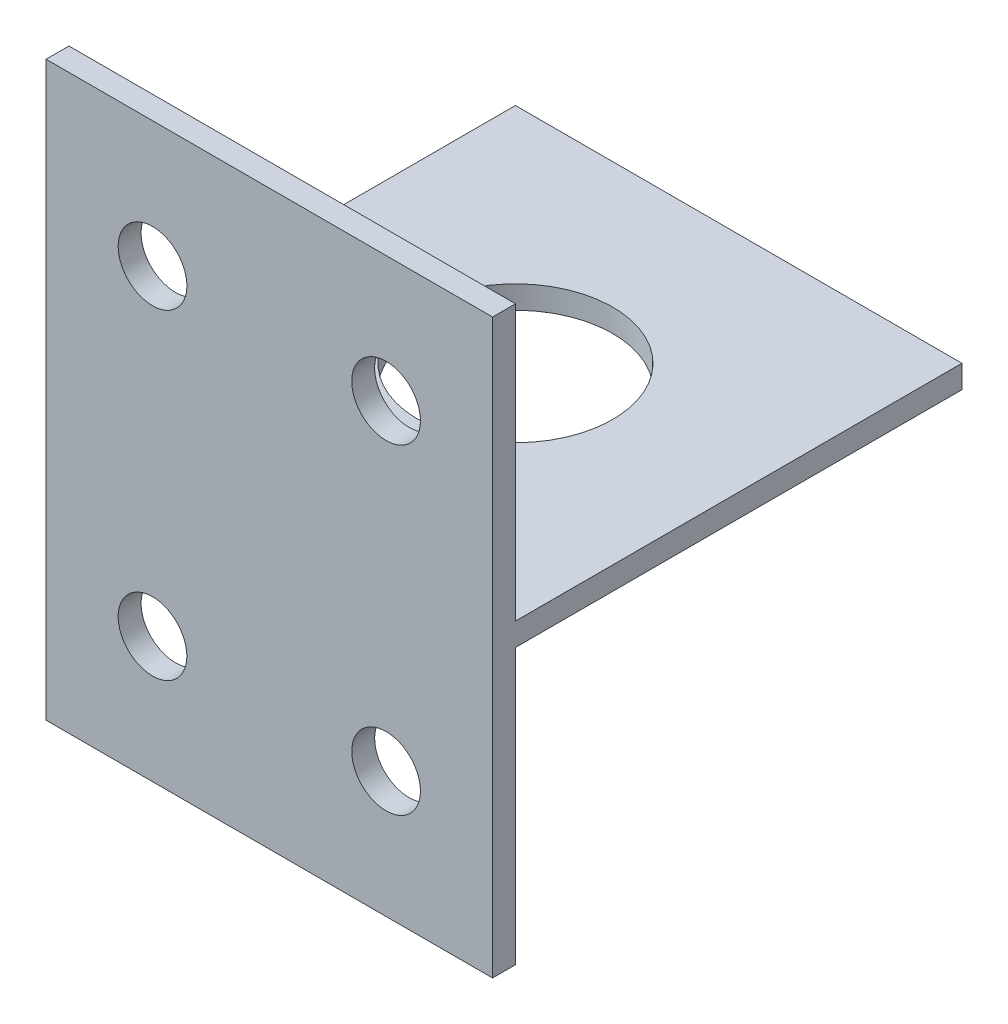
ISO-10303-21;
HEADER;
FILE_DESCRIPTION(('STEP AP214'),'2;1');
FILE_NAME('part.step','',(''),(''),'','','');
FILE_SCHEMA(('AUTOMOTIVE_DESIGN { 1 0 10303 214 1 1 1 1 }'));
ENDSEC;
DATA;
#1=APPLICATION_CONTEXT('core data for automotive mechanical design processes');
#2=APPLICATION_PROTOCOL_DEFINITION('international standard','automotive_design',2000,#1);
#3=PRODUCT_CONTEXT('',#1,'mechanical');
#4=PRODUCT('Part','Part','',(#3));
#5=PRODUCT_RELATED_PRODUCT_CATEGORY('part','',(#4));
#6=PRODUCT_DEFINITION_FORMATION('','',#4);
#7=PRODUCT_DEFINITION_CONTEXT('part definition',#1,'design');
#8=PRODUCT_DEFINITION('design','',#6,#7);
#9=PRODUCT_DEFINITION_SHAPE('','',#8);
#10=(LENGTH_UNIT() NAMED_UNIT(*) SI_UNIT(.MILLI.,.METRE.));
#11=(NAMED_UNIT(*) PLANE_ANGLE_UNIT() SI_UNIT($,.RADIAN.));
#12=(NAMED_UNIT(*) SI_UNIT($,.STERADIAN.) SOLID_ANGLE_UNIT());
#13=UNCERTAINTY_MEASURE_WITH_UNIT(LENGTH_MEASURE(1.E-05),#10,'distance_accuracy_value','');
#14=(GEOMETRIC_REPRESENTATION_CONTEXT(3) GLOBAL_UNCERTAINTY_ASSIGNED_CONTEXT((#13)) GLOBAL_UNIT_ASSIGNED_CONTEXT((#10,
#11,#12)) REPRESENTATION_CONTEXT('',''));
#15=CARTESIAN_POINT('',(0.,0.,0.));
#16=DIRECTION('',(0.,0.,1.));
#17=DIRECTION('',(1.,0.,0.));
#18=AXIS2_PLACEMENT_3D('',#15,#16,#17);
#19=CARTESIAN_POINT('',(0.,0.,0.));
#20=DIRECTION('',(0.,0.,1.));
#21=DIRECTION('',(1.,0.,0.));
#22=AXIS2_PLACEMENT_3D('',#19,#20,#21);
#23=PLANE('',#22);
#24=CARTESIAN_POINT('',(5.10059027183304,7.00228745871975,0.));
#25=DIRECTION('',(0.,0.,-1.));
#26=DIRECTION('',(1.,0.,0.));
#27=AXIS2_PLACEMENT_3D('',#24,#25,#26);
#28=CIRCLE('',#27,1.5);
#29=CARTESIAN_POINT('',(6.60059027183304,7.00228745871975,0.));
#30=VERTEX_POINT('',#29);
#31=EDGE_CURVE('E403',#30,#30,#28,.T.);
#32=ORIENTED_EDGE('',*,*,#31,.F.);
#33=EDGE_LOOP('',(#32));
#34=FACE_BOUND('',#33,.T.);
#35=CARTESIAN_POINT('',(-5.10059027183304,7.00228745871976,0.));
#36=DIRECTION('',(0.,0.,-1.));
#37=DIRECTION('',(-1.,0.,0.));
#38=AXIS2_PLACEMENT_3D('',#35,#36,#37);
#39=CIRCLE('',#38,1.5);
#40=CARTESIAN_POINT('',(-6.60059027183304,7.00228745871976,0.));
#41=VERTEX_POINT('',#40);
#42=EDGE_CURVE('E407',#41,#41,#39,.T.);
#43=ORIENTED_EDGE('',*,*,#42,.F.);
#44=EDGE_LOOP('',(#43));
#45=FACE_BOUND('',#44,.T.);
#46=DIRECTION('',(1.,0.,0.));
#47=VECTOR('',#46,1.);
#48=CARTESIAN_POINT('',(-9.75,0.500000000000001,0.));
#49=LINE('',#48,#47);
#50=CARTESIAN_POINT('',(-9.75,0.499999999999997,0.));
#51=VERTEX_POINT('',#50);
#52=CARTESIAN_POINT('',(9.75,0.499999999999997,0.));
#53=VERTEX_POINT('',#52);
#54=EDGE_CURVE('E131',#51,#53,#49,.T.);
#55=ORIENTED_EDGE('',*,*,#54,.F.);
#56=DIRECTION('',(0.,-1.,0.));
#57=VECTOR('',#56,1.);
#58=CARTESIAN_POINT('',(-9.75,-12.5,0.));
#59=LINE('',#58,#57);
#60=CARTESIAN_POINT('',(-9.75,12.5,0.));
#61=VERTEX_POINT('',#60);
#62=EDGE_CURVE('E141',#61,#51,#59,.T.);
#63=ORIENTED_EDGE('',*,*,#62,.F.);
#64=DIRECTION('',(-1.,0.,0.));
#65=VECTOR('',#64,1.);
#66=CARTESIAN_POINT('',(9.75,12.5,0.));
#67=LINE('',#66,#65);
#68=CARTESIAN_POINT('',(9.75,12.5,0.));
#69=VERTEX_POINT('',#68);
#70=EDGE_CURVE('E152',#69,#61,#67,.T.);
#71=ORIENTED_EDGE('',*,*,#70,.F.);
#72=DIRECTION('',(0.,1.,0.));
#73=VECTOR('',#72,1.);
#74=CARTESIAN_POINT('',(9.75,-12.5,0.));
#75=LINE('',#74,#73);
#76=EDGE_CURVE('E59',#53,#69,#75,.T.);
#77=ORIENTED_EDGE('',*,*,#76,.F.);
#78=EDGE_LOOP('',(#55,#63,#71,#77));
#79=FACE_BOUND('',#78,.T.);
#80=ADVANCED_FACE('F43',(#34,#45,#79),#23,.F.);
#81=CARTESIAN_POINT('',(-5.10059027183304,-7.00228745871976,0.));
#82=DIRECTION('',(0.,0.,-1.));
#83=DIRECTION('',(1.,0.,0.));
#84=AXIS2_PLACEMENT_3D('',#81,#82,#83);
#85=CIRCLE('',#84,1.5);
#86=CARTESIAN_POINT('',(-3.60059027183304,-7.00228745871976,0.));
#87=VERTEX_POINT('',#86);
#88=EDGE_CURVE('E412',#87,#87,#85,.T.);
#89=ORIENTED_EDGE('',*,*,#88,.F.);
#90=EDGE_LOOP('',(#89));
#91=FACE_BOUND('',#90,.T.);
#92=CARTESIAN_POINT('',(5.10059027183304,-7.00228745871975,0.));
#93=DIRECTION('',(0.,0.,-1.));
#94=DIRECTION('',(-1.,0.,0.));
#95=AXIS2_PLACEMENT_3D('',#92,#93,#94);
#96=CIRCLE('',#95,1.5);
#97=CARTESIAN_POINT('',(3.60059027183304,-7.00228745871975,0.));
#98=VERTEX_POINT('',#97);
#99=EDGE_CURVE('E395',#98,#98,#96,.T.);
#100=ORIENTED_EDGE('',*,*,#99,.F.);
#101=EDGE_LOOP('',(#100));
#102=FACE_BOUND('',#101,.T.);
#103=DIRECTION('',(-1.,0.,0.));
#104=VECTOR('',#103,1.);
#105=CARTESIAN_POINT('',(-9.75,-0.499999999999999,0.));
#106=LINE('',#105,#104);
#107=CARTESIAN_POINT('',(9.75,-0.500000000000004,0.));
#108=VERTEX_POINT('',#107);
#109=CARTESIAN_POINT('',(-9.75,-0.499999999999999,0.));
#110=VERTEX_POINT('',#109);
#111=EDGE_CURVE('E67',#108,#110,#106,.T.);
#112=ORIENTED_EDGE('',*,*,#111,.F.);
#113=CARTESIAN_POINT('',(9.75,-12.5,0.));
#114=VERTEX_POINT('',#113);
#115=EDGE_CURVE('E135',#114,#108,#75,.T.);
#116=ORIENTED_EDGE('',*,*,#115,.F.);
#117=DIRECTION('',(1.,0.,0.));
#118=VECTOR('',#117,1.);
#119=CARTESIAN_POINT('',(9.75,-12.5,0.));
#120=LINE('',#119,#118);
#121=CARTESIAN_POINT('',(-9.75,-12.5,0.));
#122=VERTEX_POINT('',#121);
#123=EDGE_CURVE('E164',#122,#114,#120,.T.);
#124=ORIENTED_EDGE('',*,*,#123,.F.);
#125=EDGE_CURVE('E137',#110,#122,#59,.T.);
#126=ORIENTED_EDGE('',*,*,#125,.F.);
#127=EDGE_LOOP('',(#112,#116,#124,#126));
#128=FACE_BOUND('',#127,.T.);
#129=ADVANCED_FACE('F183',(#91,#102,#128),#23,.F.);
#130=CARTESIAN_POINT('',(-9.75,-12.5,1.));
#131=DIRECTION('',(1.,0.,0.));
#132=DIRECTION('',(0.,0.,-1.));
#133=AXIS2_PLACEMENT_3D('',#130,#131,#132);
#134=PLANE('',#133);
#135=ORIENTED_EDGE('',*,*,#62,.T.);
#136=DIRECTION('',(0.,0.,1.));
#137=VECTOR('',#136,1.);
#138=CARTESIAN_POINT('',(-9.75,0.500000000000001,-19.5));
#139=LINE('',#138,#137);
#140=CARTESIAN_POINT('',(-9.75,0.500000000000001,-19.5));
#141=VERTEX_POINT('',#140);
#142=EDGE_CURVE('E143',#141,#51,#139,.T.);
#143=ORIENTED_EDGE('',*,*,#142,.F.);
#144=DIRECTION('',(0.,1.,0.));
#145=VECTOR('',#144,1.);
#146=CARTESIAN_POINT('',(-9.75,-0.499999999999999,-19.5));
#147=LINE('',#146,#145);
#148=CARTESIAN_POINT('',(-9.75,-0.499999999999999,-19.5));
#149=VERTEX_POINT('',#148);
#150=EDGE_CURVE('E120',#149,#141,#147,.T.);
#151=ORIENTED_EDGE('',*,*,#150,.F.);
#152=DIRECTION('',(0.,0.,1.));
#153=VECTOR('',#152,1.);
#154=CARTESIAN_POINT('',(-9.75,-0.499999999999999,-19.5));
#155=LINE('',#154,#153);
#156=EDGE_CURVE('E116',#149,#110,#155,.T.);
#157=ORIENTED_EDGE('',*,*,#156,.T.);
#158=ORIENTED_EDGE('',*,*,#125,.T.);
#159=DIRECTION('',(0.,0.,-1.));
#160=VECTOR('',#159,1.);
#161=CARTESIAN_POINT('',(-9.75,-12.5,1.));
#162=LINE('',#161,#160);
#163=CARTESIAN_POINT('',(-9.75,-12.5,1.));
#164=VERTEX_POINT('',#163);
#165=EDGE_CURVE('E11',#164,#122,#162,.T.);
#166=ORIENTED_EDGE('',*,*,#165,.F.);
#167=DIRECTION('',(0.,-1.,0.));
#168=VECTOR('',#167,1.);
#169=CARTESIAN_POINT('',(-9.75,-12.5,1.));
#170=LINE('',#169,#168);
#171=CARTESIAN_POINT('',(-9.75,12.5,1.));
#172=VERTEX_POINT('',#171);
#173=EDGE_CURVE('E147',#172,#164,#170,.T.);
#174=ORIENTED_EDGE('',*,*,#173,.F.);
#175=DIRECTION('',(0.,0.,-1.));
#176=VECTOR('',#175,1.);
#177=CARTESIAN_POINT('',(-9.75,12.5,1.));
#178=LINE('',#177,#176);
#179=EDGE_CURVE('E160',#172,#61,#178,.T.);
#180=ORIENTED_EDGE('',*,*,#179,.T.);
#181=EDGE_LOOP('',(#135,#143,#151,#157,#158,#166,#174,#180));
#182=FACE_BOUND('',#181,.T.);
#183=ADVANCED_FACE('F45',(#182),#134,.F.);
#184=CARTESIAN_POINT('',(9.75,-12.5,1.));
#185=DIRECTION('',(0.,1.,0.));
#186=DIRECTION('',(-1.,0.,0.));
#187=AXIS2_PLACEMENT_3D('',#184,#185,#186);
#188=PLANE('',#187);
#189=ORIENTED_EDGE('',*,*,#123,.T.);
#190=DIRECTION('',(0.,0.,-1.));
#191=VECTOR('',#190,1.);
#192=CARTESIAN_POINT('',(9.75,-12.5,1.));
#193=LINE('',#192,#191);
#194=CARTESIAN_POINT('',(9.75,-12.5,1.));
#195=VERTEX_POINT('',#194);
#196=EDGE_CURVE('E52',#195,#114,#193,.T.);
#197=ORIENTED_EDGE('',*,*,#196,.F.);
#198=DIRECTION('',(1.,0.,0.));
#199=VECTOR('',#198,1.);
#200=CARTESIAN_POINT('',(9.75,-12.5,1.));
#201=LINE('',#200,#199);
#202=EDGE_CURVE('E151',#164,#195,#201,.T.);
#203=ORIENTED_EDGE('',*,*,#202,.F.);
#204=ORIENTED_EDGE('',*,*,#165,.T.);
#205=EDGE_LOOP('',(#189,#197,#203,#204));
#206=FACE_BOUND('',#205,.T.);
#207=ADVANCED_FACE('F185',(#206),#188,.F.);
#208=CARTESIAN_POINT('',(9.75,-12.5,1.));
#209=DIRECTION('',(-1.,0.,0.));
#210=DIRECTION('',(0.,0.,1.));
#211=AXIS2_PLACEMENT_3D('',#208,#209,#210);
#212=PLANE('',#211);
#213=ORIENTED_EDGE('',*,*,#115,.T.);
#214=DIRECTION('',(0.,0.,1.));
#215=VECTOR('',#214,1.);
#216=CARTESIAN_POINT('',(9.75,-0.500000000000001,-19.5));
#217=LINE('',#216,#215);
#218=CARTESIAN_POINT('',(9.75,-0.500000000000001,-19.5));
#219=VERTEX_POINT('',#218);
#220=EDGE_CURVE('E114',#219,#108,#217,.T.);
#221=ORIENTED_EDGE('',*,*,#220,.F.);
#222=DIRECTION('',(0.,-1.,0.));
#223=VECTOR('',#222,1.);
#224=CARTESIAN_POINT('',(9.75,-0.500000000000001,-19.5));
#225=LINE('',#224,#223);
#226=CARTESIAN_POINT('',(9.75,0.499999999999999,-19.5));
#227=VERTEX_POINT('',#226);
#228=EDGE_CURVE('E121',#227,#219,#225,.T.);
#229=ORIENTED_EDGE('',*,*,#228,.F.);
#230=DIRECTION('',(0.,0.,1.));
#231=VECTOR('',#230,1.);
#232=CARTESIAN_POINT('',(9.75,0.499999999999999,-19.5));
#233=LINE('',#232,#231);
#234=EDGE_CURVE('E193',#227,#53,#233,.T.);
#235=ORIENTED_EDGE('',*,*,#234,.T.);
#236=ORIENTED_EDGE('',*,*,#76,.T.);
#237=DIRECTION('',(0.,0.,-1.));
#238=VECTOR('',#237,1.);
#239=CARTESIAN_POINT('',(9.75,12.5,1.));
#240=LINE('',#239,#238);
#241=CARTESIAN_POINT('',(9.75,12.5,1.));
#242=VERTEX_POINT('',#241);
#243=EDGE_CURVE('E174',#242,#69,#240,.T.);
#244=ORIENTED_EDGE('',*,*,#243,.F.);
#245=DIRECTION('',(0.,1.,0.));
#246=VECTOR('',#245,1.);
#247=CARTESIAN_POINT('',(9.75,-12.5,1.));
#248=LINE('',#247,#246);
#249=EDGE_CURVE('E155',#195,#242,#248,.T.);
#250=ORIENTED_EDGE('',*,*,#249,.F.);
#251=ORIENTED_EDGE('',*,*,#196,.T.);
#252=EDGE_LOOP('',(#213,#221,#229,#235,#236,#244,#250,#251));
#253=FACE_BOUND('',#252,.T.);
#254=ADVANCED_FACE('F133',(#253),#212,.F.);
#255=CARTESIAN_POINT('',(9.75,12.5,1.));
#256=DIRECTION('',(0.,-1.,0.));
#257=DIRECTION('',(1.,0.,0.));
#258=AXIS2_PLACEMENT_3D('',#255,#256,#257);
#259=PLANE('',#258);
#260=ORIENTED_EDGE('',*,*,#70,.T.);
#261=ORIENTED_EDGE('',*,*,#179,.F.);
#262=DIRECTION('',(-1.,0.,0.));
#263=VECTOR('',#262,1.);
#264=CARTESIAN_POINT('',(9.75,12.5,1.));
#265=LINE('',#264,#263);
#266=EDGE_CURVE('E158',#242,#172,#265,.T.);
#267=ORIENTED_EDGE('',*,*,#266,.F.);
#268=ORIENTED_EDGE('',*,*,#243,.T.);
#269=EDGE_LOOP('',(#260,#261,#267,#268));
#270=FACE_BOUND('',#269,.T.);
#271=ADVANCED_FACE('F208',(#270),#259,.F.);
#272=CARTESIAN_POINT('',(0.,0.,1.));
#273=DIRECTION('',(0.,0.,1.));
#274=DIRECTION('',(1.,0.,0.));
#275=AXIS2_PLACEMENT_3D('',#272,#273,#274);
#276=PLANE('',#275);
#277=CARTESIAN_POINT('',(5.10059027183304,7.00228745871975,1.));
#278=DIRECTION('',(0.,0.,-1.));
#279=DIRECTION('',(1.,0.,0.));
#280=AXIS2_PLACEMENT_3D('',#277,#278,#279);
#281=CIRCLE('',#280,1.5);
#282=CARTESIAN_POINT('',(6.60059027183304,7.00228745871975,1.));
#283=VERTEX_POINT('',#282);
#284=EDGE_CURVE('E408',#283,#283,#281,.T.);
#285=ORIENTED_EDGE('',*,*,#284,.T.);
#286=EDGE_LOOP('',(#285));
#287=FACE_BOUND('',#286,.T.);
#288=CARTESIAN_POINT('',(-5.10059027183304,-7.00228745871976,1.));
#289=DIRECTION('',(0.,0.,-1.));
#290=DIRECTION('',(1.,0.,0.));
#291=AXIS2_PLACEMENT_3D('',#288,#289,#290);
#292=CIRCLE('',#291,1.5);
#293=CARTESIAN_POINT('',(-3.60059027183304,-7.00228745871976,1.));
#294=VERTEX_POINT('',#293);
#295=EDGE_CURVE('E401',#294,#294,#292,.T.);
#296=ORIENTED_EDGE('',*,*,#295,.T.);
#297=EDGE_LOOP('',(#296));
#298=FACE_BOUND('',#297,.T.);
#299=CARTESIAN_POINT('',(5.10059027183304,-7.00228745871975,1.));
#300=DIRECTION('',(0.,0.,-1.));
#301=DIRECTION('',(-1.,0.,0.));
#302=AXIS2_PLACEMENT_3D('',#299,#300,#301);
#303=CIRCLE('',#302,1.5);
#304=CARTESIAN_POINT('',(3.60059027183304,-7.00228745871975,1.));
#305=VERTEX_POINT('',#304);
#306=EDGE_CURVE('E390',#305,#305,#303,.T.);
#307=ORIENTED_EDGE('',*,*,#306,.T.);
#308=EDGE_LOOP('',(#307));
#309=FACE_BOUND('',#308,.T.);
#310=CARTESIAN_POINT('',(-5.10059027183304,7.00228745871976,1.));
#311=DIRECTION('',(0.,0.,-1.));
#312=DIRECTION('',(-1.,0.,0.));
#313=AXIS2_PLACEMENT_3D('',#310,#311,#312);
#314=CIRCLE('',#313,1.5);
#315=CARTESIAN_POINT('',(-6.60059027183304,7.00228745871976,1.));
#316=VERTEX_POINT('',#315);
#317=EDGE_CURVE('E198',#316,#316,#314,.T.);
#318=ORIENTED_EDGE('',*,*,#317,.T.);
#319=EDGE_LOOP('',(#318));
#320=FACE_BOUND('',#319,.T.);
#321=ORIENTED_EDGE('',*,*,#173,.T.);
#322=ORIENTED_EDGE('',*,*,#202,.T.);
#323=ORIENTED_EDGE('',*,*,#249,.T.);
#324=ORIENTED_EDGE('',*,*,#266,.T.);
#325=EDGE_LOOP('',(#321,#322,#323,#324));
#326=FACE_BOUND('',#325,.T.);
#327=ADVANCED_FACE('F222',(#287,#298,#309,#320,#326),#276,.T.);
#328=CARTESIAN_POINT('',(-9.75,-0.499999999999999,-19.5));
#329=DIRECTION('',(0.,1.,0.));
#330=DIRECTION('',(-1.,0.,0.));
#331=AXIS2_PLACEMENT_3D('',#328,#329,#330);
#332=PLANE('',#331);
#333=CARTESIAN_POINT('',(0.,-0.5,-9.75));
#334=DIRECTION('',(0.,1.,0.));
#335=DIRECTION('',(-1.,0.,0.));
#336=AXIS2_PLACEMENT_3D('',#333,#334,#335);
#337=CIRCLE('',#336,4.25);
#338=CARTESIAN_POINT('',(-4.25,-0.5,-9.75));
#339=VERTEX_POINT('',#338);
#340=EDGE_CURVE('E388',#339,#339,#337,.T.);
#341=ORIENTED_EDGE('',*,*,#340,.T.);
#342=EDGE_LOOP('',(#341));
#343=FACE_BOUND('',#342,.T.);
#344=ORIENTED_EDGE('',*,*,#111,.T.);
#345=ORIENTED_EDGE('',*,*,#156,.F.);
#346=DIRECTION('',(-1.,0.,0.));
#347=VECTOR('',#346,1.);
#348=CARTESIAN_POINT('',(-9.75,-0.499999999999999,-19.5));
#349=LINE('',#348,#347);
#350=EDGE_CURVE('E110',#219,#149,#349,.T.);
#351=ORIENTED_EDGE('',*,*,#350,.F.);
#352=ORIENTED_EDGE('',*,*,#220,.T.);
#353=EDGE_LOOP('',(#344,#345,#351,#352));
#354=FACE_BOUND('',#353,.T.);
#355=ADVANCED_FACE('F112',(#343,#354),#332,.F.);
#356=CARTESIAN_POINT('',(-9.75,0.500000000000001,-19.5));
#357=DIRECTION('',(0.,-1.,0.));
#358=DIRECTION('',(1.,0.,0.));
#359=AXIS2_PLACEMENT_3D('',#356,#357,#358);
#360=PLANE('',#359);
#361=CARTESIAN_POINT('',(0.,0.5,-9.75));
#362=DIRECTION('',(0.,1.,0.));
#363=DIRECTION('',(-1.,0.,0.));
#364=AXIS2_PLACEMENT_3D('',#361,#362,#363);
#365=CIRCLE('',#364,4.25);
#366=CARTESIAN_POINT('',(-4.25,0.5,-9.75));
#367=VERTEX_POINT('',#366);
#368=EDGE_CURVE('E385',#367,#367,#365,.T.);
#369=ORIENTED_EDGE('',*,*,#368,.F.);
#370=EDGE_LOOP('',(#369));
#371=FACE_BOUND('',#370,.T.);
#372=ORIENTED_EDGE('',*,*,#54,.T.);
#373=ORIENTED_EDGE('',*,*,#234,.F.);
#374=DIRECTION('',(1.,0.,0.));
#375=VECTOR('',#374,1.);
#376=CARTESIAN_POINT('',(-9.75,0.500000000000001,-19.5));
#377=LINE('',#376,#375);
#378=EDGE_CURVE('E126',#141,#227,#377,.T.);
#379=ORIENTED_EDGE('',*,*,#378,.F.);
#380=ORIENTED_EDGE('',*,*,#142,.T.);
#381=EDGE_LOOP('',(#372,#373,#379,#380));
#382=FACE_BOUND('',#381,.T.);
#383=ADVANCED_FACE('F204',(#371,#382),#360,.F.);
#384=CARTESIAN_POINT('',(0.,0.,-19.5));
#385=DIRECTION('',(0.,0.,-1.));
#386=DIRECTION('',(-1.,0.,0.));
#387=AXIS2_PLACEMENT_3D('',#384,#385,#386);
#388=PLANE('',#387);
#389=ORIENTED_EDGE('',*,*,#228,.T.);
#390=ORIENTED_EDGE('',*,*,#350,.T.);
#391=ORIENTED_EDGE('',*,*,#150,.T.);
#392=ORIENTED_EDGE('',*,*,#378,.T.);
#393=EDGE_LOOP('',(#389,#390,#391,#392));
#394=FACE_BOUND('',#393,.T.);
#395=ADVANCED_FACE('F124',(#394),#388,.T.);
#396=CARTESIAN_POINT('',(-5.10059027183304,7.00228745871976,1.));
#397=DIRECTION('',(0.,0.,-1.));
#398=DIRECTION('',(-1.,0.,0.));
#399=AXIS2_PLACEMENT_3D('',#396,#397,#398);
#400=CYLINDRICAL_SURFACE('',#399,1.5);
#401=ORIENTED_EDGE('',*,*,#317,.F.);
#402=EDGE_LOOP('',(#401));
#403=FACE_BOUND('',#402,.T.);
#404=ORIENTED_EDGE('',*,*,#42,.T.);
#405=EDGE_LOOP('',(#404));
#406=FACE_BOUND('',#405,.T.);
#407=ADVANCED_FACE('F258',(#403,#406),#400,.F.);
#408=CARTESIAN_POINT('',(5.10059027183304,-7.00228745871975,1.));
#409=DIRECTION('',(0.,0.,-1.));
#410=DIRECTION('',(-1.,0.,0.));
#411=AXIS2_PLACEMENT_3D('',#408,#409,#410);
#412=CYLINDRICAL_SURFACE('',#411,1.5);
#413=ORIENTED_EDGE('',*,*,#306,.F.);
#414=EDGE_LOOP('',(#413));
#415=FACE_BOUND('',#414,.T.);
#416=ORIENTED_EDGE('',*,*,#99,.T.);
#417=EDGE_LOOP('',(#416));
#418=FACE_BOUND('',#417,.T.);
#419=ADVANCED_FACE('F263',(#415,#418),#412,.F.);
#420=CARTESIAN_POINT('',(-5.10059027183304,-7.00228745871976,1.));
#421=DIRECTION('',(0.,0.,-1.));
#422=DIRECTION('',(-1.,0.,0.));
#423=AXIS2_PLACEMENT_3D('',#420,#421,#422);
#424=CYLINDRICAL_SURFACE('',#423,1.5);
#425=ORIENTED_EDGE('',*,*,#295,.F.);
#426=EDGE_LOOP('',(#425));
#427=FACE_BOUND('',#426,.T.);
#428=ORIENTED_EDGE('',*,*,#88,.T.);
#429=EDGE_LOOP('',(#428));
#430=FACE_BOUND('',#429,.T.);
#431=ADVANCED_FACE('F276',(#427,#430),#424,.F.);
#432=CARTESIAN_POINT('',(5.10059027183304,7.00228745871975,1.));
#433=DIRECTION('',(0.,0.,-1.));
#434=DIRECTION('',(-1.,0.,0.));
#435=AXIS2_PLACEMENT_3D('',#432,#433,#434);
#436=CYLINDRICAL_SURFACE('',#435,1.5);
#437=ORIENTED_EDGE('',*,*,#284,.F.);
#438=EDGE_LOOP('',(#437));
#439=FACE_BOUND('',#438,.T.);
#440=ORIENTED_EDGE('',*,*,#31,.T.);
#441=EDGE_LOOP('',(#440));
#442=FACE_BOUND('',#441,.T.);
#443=ADVANCED_FACE('F287',(#439,#442),#436,.F.);
#444=CARTESIAN_POINT('',(0.,-12.5,-9.75));
#445=DIRECTION('',(0.,1.,0.));
#446=DIRECTION('',(-1.,0.,0.));
#447=AXIS2_PLACEMENT_3D('',#444,#445,#446);
#448=CYLINDRICAL_SURFACE('',#447,4.25);
#449=CARTESIAN_POINT('',(-4.25,0.5,-9.75));
#450=CARTESIAN_POINT('',(-4.25,0.489583333333334,-9.75));
#451=CARTESIAN_POINT('',(-4.25,0.479166666666667,-9.75));
#452=CARTESIAN_POINT('',(-4.25,0.458333333333334,-9.75));
#453=CARTESIAN_POINT('',(-4.25,0.447916666666667,-9.75));
#454=CARTESIAN_POINT('',(-4.25,0.427083333333334,-9.75));
#455=CARTESIAN_POINT('',(-4.25,0.416666666666667,-9.75));
#456=CARTESIAN_POINT('',(-4.25,0.395833333333334,-9.75));
#457=CARTESIAN_POINT('',(-4.25,0.385416666666667,-9.75));
#458=CARTESIAN_POINT('',(-4.25,0.364583333333334,-9.75));
#459=CARTESIAN_POINT('',(-4.25,0.354166666666667,-9.75));
#460=CARTESIAN_POINT('',(-4.25,0.333333333333334,-9.75));
#461=CARTESIAN_POINT('',(-4.25,0.322916666666667,-9.75));
#462=CARTESIAN_POINT('',(-4.25,0.302083333333334,-9.75));
#463=CARTESIAN_POINT('',(-4.25,0.291666666666667,-9.75));
#464=CARTESIAN_POINT('',(-4.25,0.270833333333334,-9.75));
#465=CARTESIAN_POINT('',(-4.25,0.260416666666667,-9.75));
#466=CARTESIAN_POINT('',(-4.25,0.239583333333334,-9.75));
#467=CARTESIAN_POINT('',(-4.25,0.229166666666667,-9.75));
#468=CARTESIAN_POINT('',(-4.25,0.208333333333334,-9.75));
#469=CARTESIAN_POINT('',(-4.25,0.197916666666667,-9.75));
#470=CARTESIAN_POINT('',(-4.25,0.177083333333333,-9.75));
#471=CARTESIAN_POINT('',(-4.25,0.166666666666667,-9.75));
#472=CARTESIAN_POINT('',(-4.25,0.145833333333333,-9.75));
#473=CARTESIAN_POINT('',(-4.25,0.135416666666667,-9.75));
#474=CARTESIAN_POINT('',(-4.25,0.114583333333333,-9.75));
#475=CARTESIAN_POINT('',(-4.25,0.104166666666667,-9.75));
#476=CARTESIAN_POINT('',(-4.25,0.0833333333333334,-9.75));
#477=CARTESIAN_POINT('',(-4.25,0.0729166666666667,-9.75));
#478=CARTESIAN_POINT('',(-4.25,0.0520833333333334,-9.75));
#479=CARTESIAN_POINT('',(-4.25,0.0416666666666667,-9.75));
#480=CARTESIAN_POINT('',(-4.25,0.0208333333333333,-9.75));
#481=CARTESIAN_POINT('',(-4.25,0.0104166666666667,-9.75));
#482=CARTESIAN_POINT('',(-4.25,-0.0104166666666667,-9.75));
#483=CARTESIAN_POINT('',(-4.25,-0.0208333333333333,-9.75));
#484=CARTESIAN_POINT('',(-4.25,-0.0416666666666667,-9.75));
#485=CARTESIAN_POINT('',(-4.25,-0.0520833333333334,-9.75));
#486=CARTESIAN_POINT('',(-4.25,-0.0729166666666667,-9.75));
#487=CARTESIAN_POINT('',(-4.25,-0.0833333333333334,-9.75));
#488=CARTESIAN_POINT('',(-4.25,-0.104166666666667,-9.75));
#489=CARTESIAN_POINT('',(-4.25,-0.114583333333333,-9.75));
#490=CARTESIAN_POINT('',(-4.25,-0.135416666666667,-9.75));
#491=CARTESIAN_POINT('',(-4.25,-0.145833333333333,-9.75));
#492=CARTESIAN_POINT('',(-4.25,-0.166666666666667,-9.75));
#493=CARTESIAN_POINT('',(-4.25,-0.177083333333333,-9.75));
#494=CARTESIAN_POINT('',(-4.25,-0.197916666666667,-9.75));
#495=CARTESIAN_POINT('',(-4.25,-0.208333333333334,-9.75));
#496=CARTESIAN_POINT('',(-4.25,-0.229166666666667,-9.75));
#497=CARTESIAN_POINT('',(-4.25,-0.239583333333334,-9.75));
#498=CARTESIAN_POINT('',(-4.25,-0.260416666666667,-9.75));
#499=CARTESIAN_POINT('',(-4.25,-0.270833333333334,-9.75));
#500=CARTESIAN_POINT('',(-4.25,-0.291666666666667,-9.75));
#501=CARTESIAN_POINT('',(-4.25,-0.302083333333334,-9.75));
#502=CARTESIAN_POINT('',(-4.25,-0.322916666666667,-9.75));
#503=CARTESIAN_POINT('',(-4.25,-0.333333333333334,-9.75));
#504=CARTESIAN_POINT('',(-4.25,-0.354166666666667,-9.75));
#505=CARTESIAN_POINT('',(-4.25,-0.364583333333334,-9.75));
#506=CARTESIAN_POINT('',(-4.25,-0.385416666666667,-9.75));
#507=CARTESIAN_POINT('',(-4.25,-0.395833333333334,-9.75));
#508=CARTESIAN_POINT('',(-4.25,-0.416666666666667,-9.75));
#509=CARTESIAN_POINT('',(-4.25,-0.427083333333334,-9.75));
#510=CARTESIAN_POINT('',(-4.25,-0.447916666666667,-9.75));
#511=CARTESIAN_POINT('',(-4.25,-0.458333333333334,-9.75));
#512=CARTESIAN_POINT('',(-4.25,-0.479166666666667,-9.75));
#513=CARTESIAN_POINT('',(-4.25,-0.489583333333334,-9.75));
#514=CARTESIAN_POINT('',(-4.25,-0.5,-9.75));
#515=B_SPLINE_CURVE_WITH_KNOTS('',3,(#449,#450,#451,#452,#453,#454,#455,#456,#457,#458,#459,
#460,#461,#462,#463,#464,#465,#466,#467,#468,#469,#470,#471,#472,#473,#474,#475,#476,#477,#478,
#479,#480,#481,#482,#483,#484,#485,#486,#487,#488,#489,#490,#491,#492,#493,#494,#495,#496,#497,
#498,#499,#500,#501,#502,#503,#504,#505,#506,#507,#508,#509,#510,#511,#512,#513,#514),
.UNSPECIFIED.,.F.,.F.,(4,2,2,2,2,2,2,2,2,2,2,2,2,2,2,2,2,2,2,2,2,2,2,2,2,2,2,2,2,2,2,2,4),(0.,
0.03125,0.0625000000000001,0.0937500000000001,0.125,0.15625,0.1875,0.21875,0.25,0.28125,0.3125,
0.34375,0.375,0.40625,0.4375,0.46875,0.5,0.53125,0.5625,0.593750000000001,0.625000000000001,
0.656250000000001,0.687500000000001,0.718750000000001,0.750000000000001,0.781250000000001,
0.812500000000001,0.843750000000001,0.875000000000001,0.906250000000001,0.937500000000001,
0.968750000000001,1.),.UNSPECIFIED.);
#516=EDGE_CURVE('BSEAM298',#367,#339,#515,.T.);
#517=ORIENTED_EDGE('',*,*,#368,.T.);
#518=ORIENTED_EDGE('',*,*,#340,.F.);
#519=ORIENTED_EDGE('',*,*,#516,.T.);
#520=ORIENTED_EDGE('',*,*,#516,.F.);
#521=EDGE_LOOP('',(#517,#519,#518,#520));
#522=FACE_BOUND('',#521,.T.);
#523=ADVANCED_FACE('F298',(#522),#448,.F.);
#524=CLOSED_SHELL('',(#80,#129,#183,#207,#254,#271,#327,#355,#383,#395,#407,#419,#431,#443,#523));
#525=MANIFOLD_SOLID_BREP('B2',#524);
#526=ADVANCED_BREP_SHAPE_REPRESENTATION('',(#18,#525),#14);
#527=SHAPE_DEFINITION_REPRESENTATION(#9,#526);
ENDSEC;
END-ISO-10303-21;
